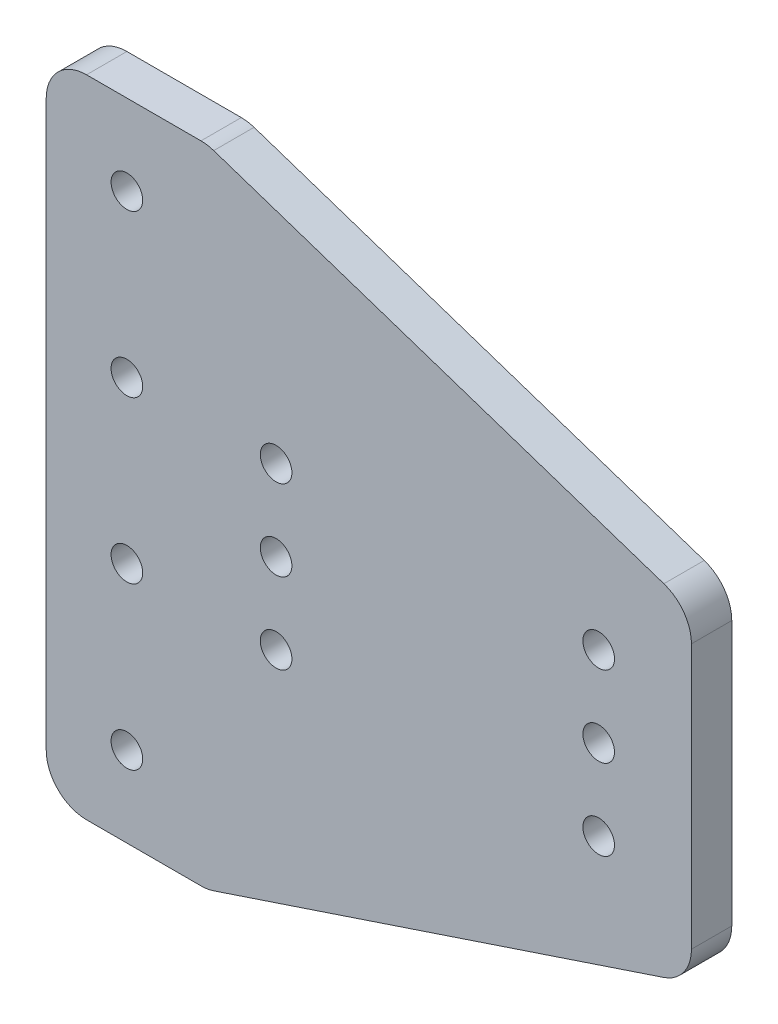
ISO-10303-21;
HEADER;
FILE_DESCRIPTION(('STEP AP214'),'2;1');
FILE_NAME('part.step','',(''),(''),'','','');
FILE_SCHEMA(('AUTOMOTIVE_DESIGN { 1 0 10303 214 1 1 1 1 }'));
ENDSEC;
DATA;
#1=APPLICATION_CONTEXT('core data for automotive mechanical design processes');
#2=APPLICATION_PROTOCOL_DEFINITION('international standard','automotive_design',2000,#1);
#3=PRODUCT_CONTEXT('',#1,'mechanical');
#4=PRODUCT('Part','Part','',(#3));
#5=PRODUCT_RELATED_PRODUCT_CATEGORY('part','',(#4));
#6=PRODUCT_DEFINITION_FORMATION('','',#4);
#7=PRODUCT_DEFINITION_CONTEXT('part definition',#1,'design');
#8=PRODUCT_DEFINITION('design','',#6,#7);
#9=PRODUCT_DEFINITION_SHAPE('','',#8);
#10=(LENGTH_UNIT() NAMED_UNIT(*) SI_UNIT(.MILLI.,.METRE.));
#11=(NAMED_UNIT(*) PLANE_ANGLE_UNIT() SI_UNIT($,.RADIAN.));
#12=(NAMED_UNIT(*) SI_UNIT($,.STERADIAN.) SOLID_ANGLE_UNIT());
#13=UNCERTAINTY_MEASURE_WITH_UNIT(LENGTH_MEASURE(1.E-05),#10,'distance_accuracy_value','');
#14=(GEOMETRIC_REPRESENTATION_CONTEXT(3) GLOBAL_UNCERTAINTY_ASSIGNED_CONTEXT((#13)) GLOBAL_UNIT_ASSIGNED_CONTEXT((#10,
#11,#12)) REPRESENTATION_CONTEXT('',''));
#15=CARTESIAN_POINT('',(0.,0.,0.));
#16=DIRECTION('',(0.,0.,1.));
#17=DIRECTION('',(1.,0.,0.));
#18=AXIS2_PLACEMENT_3D('',#15,#16,#17);
#19=CARTESIAN_POINT('',(0.,0.,6.35));
#20=DIRECTION('',(0.,0.,-1.));
#21=DIRECTION('',(-1.,0.,0.));
#22=AXIS2_PLACEMENT_3D('',#19,#20,#21);
#23=PLANE('',#22);
#24=DIRECTION('',(0.948683298050514,-0.316227766016838,0.));
#25=VECTOR('',#24,1.);
#26=CARTESIAN_POINT('',(25.4,101.6,6.35));
#27=LINE('',#26,#25);
#28=CARTESIAN_POINT('',(26.3775831721377,101.274138942621,6.35));
#29=VERTEX_POINT('',#28);
#30=CARTESIAN_POINT('',(97.2580463142069,77.6473178952644,6.35));
#31=VERTEX_POINT('',#30);
#32=EDGE_CURVE('E453',#29,#31,#27,.T.);
#33=ORIENTED_EDGE('',*,*,#32,.F.);
#34=CARTESIAN_POINT('',(24.3695368579308,95.25,6.35));
#35=DIRECTION('',(0.,0.,-1.));
#36=DIRECTION('',(-1.,0.,0.));
#37=AXIS2_PLACEMENT_3D('',#34,#35,#36);
#38=CIRCLE('',#37,6.35);
#39=CARTESIAN_POINT('',(24.3695368579308,101.6,6.35));
#40=VERTEX_POINT('',#39);
#41=EDGE_CURVE('E418',#29,#40,#38,.F.);
#42=ORIENTED_EDGE('',*,*,#41,.T.);
#43=DIRECTION('',(1.,0.,0.));
#44=VECTOR('',#43,1.);
#45=CARTESIAN_POINT('',(0.,101.6,6.35));
#46=LINE('',#45,#44);
#47=CARTESIAN_POINT('',(6.35,101.6,6.35));
#48=VERTEX_POINT('',#47);
#49=EDGE_CURVE('E449',#48,#40,#46,.T.);
#50=ORIENTED_EDGE('',*,*,#49,.F.);
#51=CARTESIAN_POINT('',(6.35,95.25,6.35));
#52=DIRECTION('',(0.,0.,-1.));
#53=DIRECTION('',(-1.,0.,0.));
#54=AXIS2_PLACEMENT_3D('',#51,#52,#53);
#55=CIRCLE('',#54,6.35);
#56=CARTESIAN_POINT('',(0.,95.25,6.35));
#57=VERTEX_POINT('',#56);
#58=EDGE_CURVE('E370',#48,#57,#55,.F.);
#59=ORIENTED_EDGE('',*,*,#58,.T.);
#60=DIRECTION('',(0.,1.,0.));
#61=VECTOR('',#60,1.);
#62=CARTESIAN_POINT('',(0.,0.,6.35));
#63=LINE('',#62,#61);
#64=CARTESIAN_POINT('',(0.,6.35,6.35));
#65=VERTEX_POINT('',#64);
#66=EDGE_CURVE('E446',#65,#57,#63,.T.);
#67=ORIENTED_EDGE('',*,*,#66,.F.);
#68=CARTESIAN_POINT('',(6.35,6.35,6.35));
#69=DIRECTION('',(0.,0.,-1.));
#70=DIRECTION('',(-1.,0.,0.));
#71=AXIS2_PLACEMENT_3D('',#68,#69,#70);
#72=CIRCLE('',#71,6.35);
#73=CARTESIAN_POINT('',(6.35,0.,6.35));
#74=VERTEX_POINT('',#73);
#75=EDGE_CURVE('E407',#65,#74,#72,.F.);
#76=ORIENTED_EDGE('',*,*,#75,.T.);
#77=DIRECTION('',(1.,0.,0.));
#78=VECTOR('',#77,1.);
#79=CARTESIAN_POINT('',(0.,0.,6.35));
#80=LINE('',#79,#78);
#81=CARTESIAN_POINT('',(24.3695368579308,0.,6.35));
#82=VERTEX_POINT('',#81);
#83=EDGE_CURVE('E372',#74,#82,#80,.T.);
#84=ORIENTED_EDGE('',*,*,#83,.T.);
#85=CARTESIAN_POINT('',(24.3695368579308,6.35,6.35));
#86=DIRECTION('',(0.,0.,-1.));
#87=DIRECTION('',(-1.,0.,0.));
#88=AXIS2_PLACEMENT_3D('',#85,#86,#87);
#89=CIRCLE('',#88,6.35);
#90=CARTESIAN_POINT('',(26.3775831721377,0.325861057379238,6.35));
#91=VERTEX_POINT('',#90);
#92=EDGE_CURVE('E413',#82,#91,#89,.F.);
#93=ORIENTED_EDGE('',*,*,#92,.T.);
#94=DIRECTION('',(0.948683298050514,0.316227766016838,0.));
#95=VECTOR('',#94,1.);
#96=CARTESIAN_POINT('',(25.4,0.,6.35));
#97=LINE('',#96,#95);
#98=CARTESIAN_POINT('',(97.2580463142069,23.9526821047356,6.35));
#99=VERTEX_POINT('',#98);
#100=EDGE_CURVE('E378',#91,#99,#97,.T.);
#101=ORIENTED_EDGE('',*,*,#100,.T.);
#102=CARTESIAN_POINT('',(95.25,29.9768210473564,6.35));
#103=DIRECTION('',(0.,0.,-1.));
#104=DIRECTION('',(-1.,0.,0.));
#105=AXIS2_PLACEMENT_3D('',#102,#103,#104);
#106=CIRCLE('',#105,6.35);
#107=CARTESIAN_POINT('',(101.6,29.9768210473564,6.35));
#108=VERTEX_POINT('',#107);
#109=EDGE_CURVE('E276',#99,#108,#106,.F.);
#110=ORIENTED_EDGE('',*,*,#109,.T.);
#111=DIRECTION('',(0.,1.,0.));
#112=VECTOR('',#111,1.);
#113=CARTESIAN_POINT('',(101.6,25.4,6.35));
#114=LINE('',#113,#112);
#115=CARTESIAN_POINT('',(101.6,71.6231789526436,6.35));
#116=VERTEX_POINT('',#115);
#117=EDGE_CURVE('E464',#108,#116,#114,.T.);
#118=ORIENTED_EDGE('',*,*,#117,.T.);
#119=CARTESIAN_POINT('',(95.25,71.6231789526436,6.35));
#120=DIRECTION('',(0.,0.,-1.));
#121=DIRECTION('',(-1.,0.,0.));
#122=AXIS2_PLACEMENT_3D('',#119,#120,#121);
#123=CIRCLE('',#122,6.35);
#124=EDGE_CURVE('E410',#116,#31,#123,.F.);
#125=ORIENTED_EDGE('',*,*,#124,.T.);
#126=EDGE_LOOP('',(#33,#42,#50,#59,#67,#76,#84,#93,#101,#110,#118,#125));
#127=FACE_BOUND('',#126,.T.);
#128=CARTESIAN_POINT('',(36.195,63.5,6.35));
#129=DIRECTION('',(0.,0.,1.));
#130=DIRECTION('',(1.,0.,0.));
#131=AXIS2_PLACEMENT_3D('',#128,#129,#130);
#132=CIRCLE('',#131,2.4892);
#133=CARTESIAN_POINT('',(38.6842,63.5,6.35));
#134=VERTEX_POINT('',#133);
#135=EDGE_CURVE('E470',#134,#134,#132,.T.);
#136=ORIENTED_EDGE('',*,*,#135,.F.);
#137=EDGE_LOOP('',(#136));
#138=FACE_BOUND('',#137,.T.);
#139=CARTESIAN_POINT('',(36.195,50.8,6.35));
#140=DIRECTION('',(0.,0.,1.));
#141=DIRECTION('',(1.,0.,0.));
#142=AXIS2_PLACEMENT_3D('',#139,#140,#141);
#143=CIRCLE('',#142,2.4892);
#144=CARTESIAN_POINT('',(38.6842,50.8,6.35));
#145=VERTEX_POINT('',#144);
#146=EDGE_CURVE('E840',#145,#145,#143,.T.);
#147=ORIENTED_EDGE('',*,*,#146,.F.);
#148=EDGE_LOOP('',(#147));
#149=FACE_BOUND('',#148,.T.);
#150=CARTESIAN_POINT('',(36.195,38.1,6.35));
#151=DIRECTION('',(0.,0.,1.));
#152=DIRECTION('',(1.,0.,0.));
#153=AXIS2_PLACEMENT_3D('',#150,#151,#152);
#154=CIRCLE('',#153,2.4892);
#155=CARTESIAN_POINT('',(38.6842,38.1,6.35));
#156=VERTEX_POINT('',#155);
#157=EDGE_CURVE('E832',#156,#156,#154,.T.);
#158=ORIENTED_EDGE('',*,*,#157,.F.);
#159=EDGE_LOOP('',(#158));
#160=FACE_BOUND('',#159,.T.);
#161=CARTESIAN_POINT('',(86.995,63.5,6.35));
#162=DIRECTION('',(0.,0.,1.));
#163=DIRECTION('',(1.,0.,0.));
#164=AXIS2_PLACEMENT_3D('',#161,#162,#163);
#165=CIRCLE('',#164,2.48920000000002);
#166=CARTESIAN_POINT('',(89.4842,63.5,6.35));
#167=VERTEX_POINT('',#166);
#168=EDGE_CURVE('E824',#167,#167,#165,.T.);
#169=ORIENTED_EDGE('',*,*,#168,.F.);
#170=EDGE_LOOP('',(#169));
#171=FACE_BOUND('',#170,.T.);
#172=CARTESIAN_POINT('',(86.995,50.8,6.35));
#173=DIRECTION('',(0.,0.,1.));
#174=DIRECTION('',(1.,0.,0.));
#175=AXIS2_PLACEMENT_3D('',#172,#173,#174);
#176=CIRCLE('',#175,2.4892);
#177=CARTESIAN_POINT('',(89.4842,50.8,6.35));
#178=VERTEX_POINT('',#177);
#179=EDGE_CURVE('E816',#178,#178,#176,.T.);
#180=ORIENTED_EDGE('',*,*,#179,.F.);
#181=EDGE_LOOP('',(#180));
#182=FACE_BOUND('',#181,.T.);
#183=CARTESIAN_POINT('',(86.995,38.1,6.35));
#184=DIRECTION('',(0.,0.,1.));
#185=DIRECTION('',(1.,0.,0.));
#186=AXIS2_PLACEMENT_3D('',#183,#184,#185);
#187=CIRCLE('',#186,2.4892);
#188=CARTESIAN_POINT('',(89.4842,38.1,6.35));
#189=VERTEX_POINT('',#188);
#190=EDGE_CURVE('E808',#189,#189,#187,.T.);
#191=ORIENTED_EDGE('',*,*,#190,.F.);
#192=EDGE_LOOP('',(#191));
#193=FACE_BOUND('',#192,.T.);
#194=CARTESIAN_POINT('',(12.7,88.9,6.35));
#195=DIRECTION('',(0.,0.,1.));
#196=DIRECTION('',(1.,0.,0.));
#197=AXIS2_PLACEMENT_3D('',#194,#195,#196);
#198=CIRCLE('',#197,2.4892);
#199=CARTESIAN_POINT('',(15.1892,88.9,6.35));
#200=VERTEX_POINT('',#199);
#201=EDGE_CURVE('E800',#200,#200,#198,.T.);
#202=ORIENTED_EDGE('',*,*,#201,.F.);
#203=EDGE_LOOP('',(#202));
#204=FACE_BOUND('',#203,.T.);
#205=CARTESIAN_POINT('',(12.7000000000003,63.5,6.35));
#206=DIRECTION('',(0.,0.,1.));
#207=DIRECTION('',(1.,0.,0.));
#208=AXIS2_PLACEMENT_3D('',#205,#206,#207);
#209=CIRCLE('',#208,2.4892);
#210=CARTESIAN_POINT('',(15.1892000000003,63.5,6.35));
#211=VERTEX_POINT('',#210);
#212=EDGE_CURVE('E792',#211,#211,#209,.T.);
#213=ORIENTED_EDGE('',*,*,#212,.F.);
#214=EDGE_LOOP('',(#213));
#215=FACE_BOUND('',#214,.T.);
#216=CARTESIAN_POINT('',(12.7000000000005,38.1,6.35));
#217=DIRECTION('',(0.,0.,1.));
#218=DIRECTION('',(1.,0.,0.));
#219=AXIS2_PLACEMENT_3D('',#216,#217,#218);
#220=CIRCLE('',#219,2.4892);
#221=CARTESIAN_POINT('',(15.1892000000005,38.1,6.35));
#222=VERTEX_POINT('',#221);
#223=EDGE_CURVE('E776',#222,#222,#220,.T.);
#224=ORIENTED_EDGE('',*,*,#223,.F.);
#225=EDGE_LOOP('',(#224));
#226=FACE_BOUND('',#225,.T.);
#227=CARTESIAN_POINT('',(12.7000000000008,12.7,6.35));
#228=DIRECTION('',(0.,0.,1.));
#229=DIRECTION('',(1.,0.,0.));
#230=AXIS2_PLACEMENT_3D('',#227,#228,#229);
#231=CIRCLE('',#230,2.4892);
#232=CARTESIAN_POINT('',(15.1892000000008,12.7,6.35));
#233=VERTEX_POINT('',#232);
#234=EDGE_CURVE('E781',#233,#233,#231,.T.);
#235=ORIENTED_EDGE('',*,*,#234,.F.);
#236=EDGE_LOOP('',(#235));
#237=FACE_BOUND('',#236,.T.);
#238=ADVANCED_FACE('F253',(#127,#138,#149,#160,#171,#182,#193,#204,#215,#226,#237),#23,.F.);
#239=CARTESIAN_POINT('',(0.,0.,0.));
#240=DIRECTION('',(0.,0.,-1.));
#241=DIRECTION('',(-1.,0.,0.));
#242=AXIS2_PLACEMENT_3D('',#239,#240,#241);
#243=PLANE('',#242);
#244=CARTESIAN_POINT('',(12.7000000000005,38.1,0.));
#245=DIRECTION('',(0.,0.,1.));
#246=DIRECTION('',(1.,0.,0.));
#247=AXIS2_PLACEMENT_3D('',#244,#245,#246);
#248=CIRCLE('',#247,2.4892);
#249=CARTESIAN_POINT('',(15.1892000000005,38.1,0.));
#250=VERTEX_POINT('',#249);
#251=EDGE_CURVE('E779',#250,#250,#248,.T.);
#252=ORIENTED_EDGE('',*,*,#251,.T.);
#253=EDGE_LOOP('',(#252));
#254=FACE_BOUND('',#253,.T.);
#255=CARTESIAN_POINT('',(12.7,88.9,0.));
#256=DIRECTION('',(0.,0.,1.));
#257=DIRECTION('',(1.,0.,0.));
#258=AXIS2_PLACEMENT_3D('',#255,#256,#257);
#259=CIRCLE('',#258,2.4892);
#260=CARTESIAN_POINT('',(15.1892,88.9,0.));
#261=VERTEX_POINT('',#260);
#262=EDGE_CURVE('E796',#261,#261,#259,.T.);
#263=ORIENTED_EDGE('',*,*,#262,.T.);
#264=EDGE_LOOP('',(#263));
#265=FACE_BOUND('',#264,.T.);
#266=CARTESIAN_POINT('',(86.995,50.8,0.));
#267=DIRECTION('',(0.,0.,1.));
#268=DIRECTION('',(1.,0.,0.));
#269=AXIS2_PLACEMENT_3D('',#266,#267,#268);
#270=CIRCLE('',#269,2.4892);
#271=CARTESIAN_POINT('',(89.4842,50.8,0.));
#272=VERTEX_POINT('',#271);
#273=EDGE_CURVE('E812',#272,#272,#270,.T.);
#274=ORIENTED_EDGE('',*,*,#273,.T.);
#275=EDGE_LOOP('',(#274));
#276=FACE_BOUND('',#275,.T.);
#277=CARTESIAN_POINT('',(36.195,38.1,0.));
#278=DIRECTION('',(0.,0.,1.));
#279=DIRECTION('',(1.,0.,0.));
#280=AXIS2_PLACEMENT_3D('',#277,#278,#279);
#281=CIRCLE('',#280,2.4892);
#282=CARTESIAN_POINT('',(38.6842,38.1,0.));
#283=VERTEX_POINT('',#282);
#284=EDGE_CURVE('E828',#283,#283,#281,.T.);
#285=ORIENTED_EDGE('',*,*,#284,.T.);
#286=EDGE_LOOP('',(#285));
#287=FACE_BOUND('',#286,.T.);
#288=CARTESIAN_POINT('',(36.195,63.5,0.));
#289=DIRECTION('',(0.,0.,1.));
#290=DIRECTION('',(1.,0.,0.));
#291=AXIS2_PLACEMENT_3D('',#288,#289,#290);
#292=CIRCLE('',#291,2.4892);
#293=CARTESIAN_POINT('',(38.6842,63.5,0.));
#294=VERTEX_POINT('',#293);
#295=EDGE_CURVE('E458',#294,#294,#292,.T.);
#296=ORIENTED_EDGE('',*,*,#295,.T.);
#297=EDGE_LOOP('',(#296));
#298=FACE_BOUND('',#297,.T.);
#299=DIRECTION('',(1.,0.,0.));
#300=VECTOR('',#299,1.);
#301=CARTESIAN_POINT('',(0.,101.6,0.));
#302=LINE('',#301,#300);
#303=CARTESIAN_POINT('',(6.35,101.6,0.));
#304=VERTEX_POINT('',#303);
#305=CARTESIAN_POINT('',(24.3695368579308,101.6,0.));
#306=VERTEX_POINT('',#305);
#307=EDGE_CURVE('E348',#304,#306,#302,.T.);
#308=ORIENTED_EDGE('',*,*,#307,.T.);
#309=CARTESIAN_POINT('',(24.3695368579308,95.25,0.));
#310=DIRECTION('',(0.,0.,-1.));
#311=DIRECTION('',(-1.,0.,0.));
#312=AXIS2_PLACEMENT_3D('',#309,#310,#311);
#313=CIRCLE('',#312,6.35);
#314=CARTESIAN_POINT('',(26.3775831721377,101.274138942621,0.));
#315=VERTEX_POINT('',#314);
#316=EDGE_CURVE('E395',#306,#315,#313,.T.);
#317=ORIENTED_EDGE('',*,*,#316,.T.);
#318=DIRECTION('',(0.948683298050514,-0.316227766016838,0.));
#319=VECTOR('',#318,1.);
#320=CARTESIAN_POINT('',(25.4,101.6,0.));
#321=LINE('',#320,#319);
#322=CARTESIAN_POINT('',(97.2580463142069,77.6473178952644,0.));
#323=VERTEX_POINT('',#322);
#324=EDGE_CURVE('E367',#315,#323,#321,.T.);
#325=ORIENTED_EDGE('',*,*,#324,.T.);
#326=CARTESIAN_POINT('',(95.25,71.6231789526436,0.));
#327=DIRECTION('',(0.,0.,-1.));
#328=DIRECTION('',(-1.,0.,0.));
#329=AXIS2_PLACEMENT_3D('',#326,#327,#328);
#330=CIRCLE('',#329,6.35);
#331=CARTESIAN_POINT('',(101.6,71.6231789526436,0.));
#332=VERTEX_POINT('',#331);
#333=EDGE_CURVE('E386',#323,#332,#330,.T.);
#334=ORIENTED_EDGE('',*,*,#333,.T.);
#335=DIRECTION('',(0.,1.,0.));
#336=VECTOR('',#335,1.);
#337=CARTESIAN_POINT('',(101.6,25.4,0.));
#338=LINE('',#337,#336);
#339=CARTESIAN_POINT('',(101.6,29.9768210473564,0.));
#340=VERTEX_POINT('',#339);
#341=EDGE_CURVE('E475',#340,#332,#338,.T.);
#342=ORIENTED_EDGE('',*,*,#341,.F.);
#343=CARTESIAN_POINT('',(95.25,29.9768210473564,0.));
#344=DIRECTION('',(0.,0.,-1.));
#345=DIRECTION('',(-1.,0.,0.));
#346=AXIS2_PLACEMENT_3D('',#343,#344,#345);
#347=CIRCLE('',#346,6.35);
#348=CARTESIAN_POINT('',(97.2580463142069,23.9526821047356,0.));
#349=VERTEX_POINT('',#348);
#350=EDGE_CURVE('E392',#340,#349,#347,.T.);
#351=ORIENTED_EDGE('',*,*,#350,.T.);
#352=DIRECTION('',(0.948683298050514,0.316227766016838,0.));
#353=VECTOR('',#352,1.);
#354=CARTESIAN_POINT('',(25.4,0.,0.));
#355=LINE('',#354,#353);
#356=CARTESIAN_POINT('',(26.3775831721377,0.325861057379238,0.));
#357=VERTEX_POINT('',#356);
#358=EDGE_CURVE('E456',#357,#349,#355,.T.);
#359=ORIENTED_EDGE('',*,*,#358,.F.);
#360=CARTESIAN_POINT('',(24.3695368579308,6.35,0.));
#361=DIRECTION('',(0.,0.,-1.));
#362=DIRECTION('',(-1.,0.,0.));
#363=AXIS2_PLACEMENT_3D('',#360,#361,#362);
#364=CIRCLE('',#363,6.35);
#365=CARTESIAN_POINT('',(24.3695368579308,0.,0.));
#366=VERTEX_POINT('',#365);
#367=EDGE_CURVE('E389',#357,#366,#364,.T.);
#368=ORIENTED_EDGE('',*,*,#367,.T.);
#369=DIRECTION('',(1.,0.,0.));
#370=VECTOR('',#369,1.);
#371=CARTESIAN_POINT('',(0.,0.,0.));
#372=LINE('',#371,#370);
#373=CARTESIAN_POINT('',(6.35,0.,0.));
#374=VERTEX_POINT('',#373);
#375=EDGE_CURVE('E381',#374,#366,#372,.T.);
#376=ORIENTED_EDGE('',*,*,#375,.F.);
#377=CARTESIAN_POINT('',(6.35,6.35,0.));
#378=DIRECTION('',(0.,0.,-1.));
#379=DIRECTION('',(-1.,0.,0.));
#380=AXIS2_PLACEMENT_3D('',#377,#378,#379);
#381=CIRCLE('',#380,6.35);
#382=CARTESIAN_POINT('',(0.,6.35,0.));
#383=VERTEX_POINT('',#382);
#384=EDGE_CURVE('E356',#374,#383,#381,.T.);
#385=ORIENTED_EDGE('',*,*,#384,.T.);
#386=DIRECTION('',(0.,1.,0.));
#387=VECTOR('',#386,1.);
#388=CARTESIAN_POINT('',(0.,0.,0.));
#389=LINE('',#388,#387);
#390=CARTESIAN_POINT('',(0.,95.25,0.));
#391=VERTEX_POINT('',#390);
#392=EDGE_CURVE('E350',#383,#391,#389,.T.);
#393=ORIENTED_EDGE('',*,*,#392,.T.);
#394=CARTESIAN_POINT('',(6.35,95.25,0.));
#395=DIRECTION('',(0.,0.,-1.));
#396=DIRECTION('',(-1.,0.,0.));
#397=AXIS2_PLACEMENT_3D('',#394,#395,#396);
#398=CIRCLE('',#397,6.35);
#399=EDGE_CURVE('E344',#391,#304,#398,.T.);
#400=ORIENTED_EDGE('',*,*,#399,.T.);
#401=EDGE_LOOP('',(#308,#317,#325,#334,#342,#351,#359,#368,#376,#385,#393,#400));
#402=FACE_BOUND('',#401,.T.);
#403=CARTESIAN_POINT('',(36.195,50.8,0.));
#404=DIRECTION('',(0.,0.,1.));
#405=DIRECTION('',(1.,0.,0.));
#406=AXIS2_PLACEMENT_3D('',#403,#404,#405);
#407=CIRCLE('',#406,2.4892);
#408=CARTESIAN_POINT('',(38.6842,50.8,0.));
#409=VERTEX_POINT('',#408);
#410=EDGE_CURVE('E836',#409,#409,#407,.T.);
#411=ORIENTED_EDGE('',*,*,#410,.T.);
#412=EDGE_LOOP('',(#411));
#413=FACE_BOUND('',#412,.T.);
#414=CARTESIAN_POINT('',(86.995,63.5,0.));
#415=DIRECTION('',(0.,0.,1.));
#416=DIRECTION('',(1.,0.,0.));
#417=AXIS2_PLACEMENT_3D('',#414,#415,#416);
#418=CIRCLE('',#417,2.48920000000002);
#419=CARTESIAN_POINT('',(89.4842,63.5,0.));
#420=VERTEX_POINT('',#419);
#421=EDGE_CURVE('E820',#420,#420,#418,.T.);
#422=ORIENTED_EDGE('',*,*,#421,.T.);
#423=EDGE_LOOP('',(#422));
#424=FACE_BOUND('',#423,.T.);
#425=CARTESIAN_POINT('',(86.995,38.1,0.));
#426=DIRECTION('',(0.,0.,1.));
#427=DIRECTION('',(1.,0.,0.));
#428=AXIS2_PLACEMENT_3D('',#425,#426,#427);
#429=CIRCLE('',#428,2.4892);
#430=CARTESIAN_POINT('',(89.4842,38.1,0.));
#431=VERTEX_POINT('',#430);
#432=EDGE_CURVE('E804',#431,#431,#429,.T.);
#433=ORIENTED_EDGE('',*,*,#432,.T.);
#434=EDGE_LOOP('',(#433));
#435=FACE_BOUND('',#434,.T.);
#436=CARTESIAN_POINT('',(12.7000000000003,63.5,0.));
#437=DIRECTION('',(0.,0.,1.));
#438=DIRECTION('',(1.,0.,0.));
#439=AXIS2_PLACEMENT_3D('',#436,#437,#438);
#440=CIRCLE('',#439,2.4892);
#441=CARTESIAN_POINT('',(15.1892000000003,63.5,0.));
#442=VERTEX_POINT('',#441);
#443=EDGE_CURVE('E785',#442,#442,#440,.T.);
#444=ORIENTED_EDGE('',*,*,#443,.T.);
#445=EDGE_LOOP('',(#444));
#446=FACE_BOUND('',#445,.T.);
#447=CARTESIAN_POINT('',(12.7000000000008,12.7,0.));
#448=DIRECTION('',(0.,0.,1.));
#449=DIRECTION('',(1.,0.,0.));
#450=AXIS2_PLACEMENT_3D('',#447,#448,#449);
#451=CIRCLE('',#450,2.4892);
#452=CARTESIAN_POINT('',(15.1892000000008,12.7,0.));
#453=VERTEX_POINT('',#452);
#454=EDGE_CURVE('E788',#453,#453,#451,.T.);
#455=ORIENTED_EDGE('',*,*,#454,.T.);
#456=EDGE_LOOP('',(#455));
#457=FACE_BOUND('',#456,.T.);
#458=ADVANCED_FACE('F346',(#254,#265,#276,#287,#298,#402,#413,#424,#435,#446,#457),#243,.T.);
#459=CARTESIAN_POINT('',(0.,0.,6.35));
#460=DIRECTION('',(-1.,0.,0.));
#461=DIRECTION('',(0.,0.,1.));
#462=AXIS2_PLACEMENT_3D('',#459,#460,#461);
#463=PLANE('',#462);
#464=ORIENTED_EDGE('',*,*,#392,.F.);
#465=DIRECTION('',(0.,0.,-1.));
#466=VECTOR('',#465,1.);
#467=CARTESIAN_POINT('',(0.,6.35,6.35));
#468=LINE('',#467,#466);
#469=EDGE_CURVE('E12',#383,#65,#468,.F.);
#470=ORIENTED_EDGE('',*,*,#469,.T.);
#471=ORIENTED_EDGE('',*,*,#66,.T.);
#472=DIRECTION('',(0.,0.,-1.));
#473=VECTOR('',#472,1.);
#474=CARTESIAN_POINT('',(0.,95.25,6.35));
#475=LINE('',#474,#473);
#476=EDGE_CURVE('E262',#57,#391,#475,.T.);
#477=ORIENTED_EDGE('',*,*,#476,.T.);
#478=EDGE_LOOP('',(#464,#470,#471,#477));
#479=FACE_BOUND('',#478,.T.);
#480=ADVANCED_FACE('F443',(#479),#463,.T.);
#481=CARTESIAN_POINT('',(0.,0.,6.35));
#482=DIRECTION('',(0.,1.,0.));
#483=DIRECTION('',(0.,0.,1.));
#484=AXIS2_PLACEMENT_3D('',#481,#482,#483);
#485=PLANE('',#484);
#486=ORIENTED_EDGE('',*,*,#375,.T.);
#487=DIRECTION('',(0.,0.,-1.));
#488=VECTOR('',#487,1.);
#489=CARTESIAN_POINT('',(24.3695368579308,0.,6.35));
#490=LINE('',#489,#488);
#491=EDGE_CURVE('E438',#366,#82,#490,.F.);
#492=ORIENTED_EDGE('',*,*,#491,.T.);
#493=ORIENTED_EDGE('',*,*,#83,.F.);
#494=DIRECTION('',(0.,0.,-1.));
#495=VECTOR('',#494,1.);
#496=CARTESIAN_POINT('',(6.35,0.,0.));
#497=LINE('',#496,#495);
#498=EDGE_CURVE('E434',#74,#374,#497,.T.);
#499=ORIENTED_EDGE('',*,*,#498,.T.);
#500=EDGE_LOOP('',(#486,#492,#493,#499));
#501=FACE_BOUND('',#500,.T.);
#502=ADVANCED_FACE('F527',(#501),#485,.F.);
#503=CARTESIAN_POINT('',(25.4,0.,6.35));
#504=DIRECTION('',(-0.316227766016838,0.948683298050514,0.));
#505=DIRECTION('',(-0.948683298050514,-0.316227766016838,0.));
#506=AXIS2_PLACEMENT_3D('',#503,#504,#505);
#507=PLANE('',#506);
#508=ORIENTED_EDGE('',*,*,#358,.T.);
#509=DIRECTION('',(0.,0.,-1.));
#510=VECTOR('',#509,1.);
#511=CARTESIAN_POINT('',(97.258046314207,23.9526821047357,6.35));
#512=LINE('',#511,#510);
#513=EDGE_CURVE('E431',#349,#99,#512,.F.);
#514=ORIENTED_EDGE('',*,*,#513,.T.);
#515=ORIENTED_EDGE('',*,*,#100,.F.);
#516=DIRECTION('',(0.,0.,-1.));
#517=VECTOR('',#516,1.);
#518=CARTESIAN_POINT('',(26.3775831721377,0.325861057379238,6.35));
#519=LINE('',#518,#517);
#520=EDGE_CURVE('E427',#91,#357,#519,.T.);
#521=ORIENTED_EDGE('',*,*,#520,.T.);
#522=EDGE_LOOP('',(#508,#514,#515,#521));
#523=FACE_BOUND('',#522,.T.);
#524=ADVANCED_FACE('F482',(#523),#507,.F.);
#525=CARTESIAN_POINT('',(101.6,25.4,6.35));
#526=DIRECTION('',(-1.,0.,0.));
#527=DIRECTION('',(0.,0.,1.));
#528=AXIS2_PLACEMENT_3D('',#525,#526,#527);
#529=PLANE('',#528);
#530=ORIENTED_EDGE('',*,*,#117,.F.);
#531=DIRECTION('',(0.,0.,-1.));
#532=VECTOR('',#531,1.);
#533=CARTESIAN_POINT('',(101.6,29.9768210473564,6.35));
#534=LINE('',#533,#532);
#535=EDGE_CURVE('E423',#108,#340,#534,.T.);
#536=ORIENTED_EDGE('',*,*,#535,.T.);
#537=ORIENTED_EDGE('',*,*,#341,.T.);
#538=DIRECTION('',(0.,0.,-1.));
#539=VECTOR('',#538,1.);
#540=CARTESIAN_POINT('',(101.6,71.6231789526436,6.35));
#541=LINE('',#540,#539);
#542=EDGE_CURVE('E269',#332,#116,#541,.F.);
#543=ORIENTED_EDGE('',*,*,#542,.T.);
#544=EDGE_LOOP('',(#530,#536,#537,#543));
#545=FACE_BOUND('',#544,.T.);
#546=ADVANCED_FACE('F489',(#545),#529,.F.);
#547=CARTESIAN_POINT('',(25.4,101.6,6.35));
#548=DIRECTION('',(0.316227766016838,0.948683298050514,0.));
#549=DIRECTION('',(-0.948683298050514,0.316227766016838,0.));
#550=AXIS2_PLACEMENT_3D('',#547,#548,#549);
#551=PLANE('',#550);
#552=ORIENTED_EDGE('',*,*,#324,.F.);
#553=DIRECTION('',(0.,0.,-1.));
#554=VECTOR('',#553,1.);
#555=CARTESIAN_POINT('',(26.3775831721377,101.274138942621,6.35));
#556=LINE('',#555,#554);
#557=EDGE_CURVE('E402',#315,#29,#556,.F.);
#558=ORIENTED_EDGE('',*,*,#557,.T.);
#559=ORIENTED_EDGE('',*,*,#32,.T.);
#560=DIRECTION('',(0.,0.,-1.));
#561=VECTOR('',#560,1.);
#562=CARTESIAN_POINT('',(97.2580463142069,77.6473178952643,0.));
#563=LINE('',#562,#561);
#564=EDGE_CURVE('E398',#31,#323,#563,.T.);
#565=ORIENTED_EDGE('',*,*,#564,.T.);
#566=EDGE_LOOP('',(#552,#558,#559,#565));
#567=FACE_BOUND('',#566,.T.);
#568=ADVANCED_FACE('F496',(#567),#551,.T.);
#569=CARTESIAN_POINT('',(0.,101.6,6.35));
#570=DIRECTION('',(0.,1.,0.));
#571=DIRECTION('',(0.,0.,1.));
#572=AXIS2_PLACEMENT_3D('',#569,#570,#571);
#573=PLANE('',#572);
#574=ORIENTED_EDGE('',*,*,#49,.T.);
#575=DIRECTION('',(0.,0.,-1.));
#576=VECTOR('',#575,1.);
#577=CARTESIAN_POINT('',(24.3695368579308,101.6,6.35));
#578=LINE('',#577,#576);
#579=EDGE_CURVE('E357',#40,#306,#578,.T.);
#580=ORIENTED_EDGE('',*,*,#579,.T.);
#581=ORIENTED_EDGE('',*,*,#307,.F.);
#582=DIRECTION('',(0.,0.,-1.));
#583=VECTOR('',#582,1.);
#584=CARTESIAN_POINT('',(6.35,101.6,6.35));
#585=LINE('',#584,#583);
#586=EDGE_CURVE('E363',#304,#48,#585,.F.);
#587=ORIENTED_EDGE('',*,*,#586,.T.);
#588=EDGE_LOOP('',(#574,#580,#581,#587));
#589=FACE_BOUND('',#588,.T.);
#590=ADVANCED_FACE('F362',(#589),#573,.T.);
#591=CARTESIAN_POINT('',(36.195,63.5,6.35));
#592=DIRECTION('',(0.,0.,-1.));
#593=DIRECTION('',(-1.,0.,0.));
#594=AXIS2_PLACEMENT_3D('',#591,#592,#593);
#595=CYLINDRICAL_SURFACE('',#594,2.4892);
#596=ORIENTED_EDGE('',*,*,#135,.T.);
#597=EDGE_LOOP('',(#596));
#598=FACE_BOUND('',#597,.T.);
#599=ORIENTED_EDGE('',*,*,#295,.F.);
#600=EDGE_LOOP('',(#599));
#601=FACE_BOUND('',#600,.T.);
#602=ADVANCED_FACE('F524',(#598,#601),#595,.F.);
#603=CARTESIAN_POINT('',(36.195,50.8,6.35));
#604=DIRECTION('',(0.,0.,-1.));
#605=DIRECTION('',(-1.,0.,0.));
#606=AXIS2_PLACEMENT_3D('',#603,#604,#605);
#607=CYLINDRICAL_SURFACE('',#606,2.4892);
#608=ORIENTED_EDGE('',*,*,#146,.T.);
#609=EDGE_LOOP('',(#608));
#610=FACE_BOUND('',#609,.T.);
#611=ORIENTED_EDGE('',*,*,#410,.F.);
#612=EDGE_LOOP('',(#611));
#613=FACE_BOUND('',#612,.T.);
#614=ADVANCED_FACE('F569',(#610,#613),#607,.F.);
#615=CARTESIAN_POINT('',(36.195,38.1,6.35));
#616=DIRECTION('',(0.,0.,-1.));
#617=DIRECTION('',(-1.,0.,0.));
#618=AXIS2_PLACEMENT_3D('',#615,#616,#617);
#619=CYLINDRICAL_SURFACE('',#618,2.4892);
#620=ORIENTED_EDGE('',*,*,#157,.T.);
#621=EDGE_LOOP('',(#620));
#622=FACE_BOUND('',#621,.T.);
#623=ORIENTED_EDGE('',*,*,#284,.F.);
#624=EDGE_LOOP('',(#623));
#625=FACE_BOUND('',#624,.T.);
#626=ADVANCED_FACE('F576',(#622,#625),#619,.F.);
#627=CARTESIAN_POINT('',(86.995,63.5,6.35));
#628=DIRECTION('',(0.,0.,-1.));
#629=DIRECTION('',(-1.,0.,0.));
#630=AXIS2_PLACEMENT_3D('',#627,#628,#629);
#631=CYLINDRICAL_SURFACE('',#630,2.48920000000002);
#632=ORIENTED_EDGE('',*,*,#168,.T.);
#633=EDGE_LOOP('',(#632));
#634=FACE_BOUND('',#633,.T.);
#635=ORIENTED_EDGE('',*,*,#421,.F.);
#636=EDGE_LOOP('',(#635));
#637=FACE_BOUND('',#636,.T.);
#638=ADVANCED_FACE('F583',(#634,#637),#631,.F.);
#639=CARTESIAN_POINT('',(86.995,50.8,6.35));
#640=DIRECTION('',(0.,0.,-1.));
#641=DIRECTION('',(-1.,0.,0.));
#642=AXIS2_PLACEMENT_3D('',#639,#640,#641);
#643=CYLINDRICAL_SURFACE('',#642,2.4892);
#644=ORIENTED_EDGE('',*,*,#179,.T.);
#645=EDGE_LOOP('',(#644));
#646=FACE_BOUND('',#645,.T.);
#647=ORIENTED_EDGE('',*,*,#273,.F.);
#648=EDGE_LOOP('',(#647));
#649=FACE_BOUND('',#648,.T.);
#650=ADVANCED_FACE('F591',(#646,#649),#643,.F.);
#651=CARTESIAN_POINT('',(86.995,38.1,6.35));
#652=DIRECTION('',(0.,0.,-1.));
#653=DIRECTION('',(-1.,0.,0.));
#654=AXIS2_PLACEMENT_3D('',#651,#652,#653);
#655=CYLINDRICAL_SURFACE('',#654,2.4892);
#656=ORIENTED_EDGE('',*,*,#190,.T.);
#657=EDGE_LOOP('',(#656));
#658=FACE_BOUND('',#657,.T.);
#659=ORIENTED_EDGE('',*,*,#432,.F.);
#660=EDGE_LOOP('',(#659));
#661=FACE_BOUND('',#660,.T.);
#662=ADVANCED_FACE('F599',(#658,#661),#655,.F.);
#663=CARTESIAN_POINT('',(12.7,88.9,6.35));
#664=DIRECTION('',(0.,0.,-1.));
#665=DIRECTION('',(-1.,0.,0.));
#666=AXIS2_PLACEMENT_3D('',#663,#664,#665);
#667=CYLINDRICAL_SURFACE('',#666,2.4892);
#668=ORIENTED_EDGE('',*,*,#201,.T.);
#669=EDGE_LOOP('',(#668));
#670=FACE_BOUND('',#669,.T.);
#671=ORIENTED_EDGE('',*,*,#262,.F.);
#672=EDGE_LOOP('',(#671));
#673=FACE_BOUND('',#672,.T.);
#674=ADVANCED_FACE('F607',(#670,#673),#667,.F.);
#675=CARTESIAN_POINT('',(12.7000000000003,63.5,6.35));
#676=DIRECTION('',(0.,0.,-1.));
#677=DIRECTION('',(-1.,0.,0.));
#678=AXIS2_PLACEMENT_3D('',#675,#676,#677);
#679=CYLINDRICAL_SURFACE('',#678,2.4892);
#680=ORIENTED_EDGE('',*,*,#212,.T.);
#681=EDGE_LOOP('',(#680));
#682=FACE_BOUND('',#681,.T.);
#683=ORIENTED_EDGE('',*,*,#443,.F.);
#684=EDGE_LOOP('',(#683));
#685=FACE_BOUND('',#684,.T.);
#686=ADVANCED_FACE('F615',(#682,#685),#679,.F.);
#687=CARTESIAN_POINT('',(12.7000000000005,38.1,6.35));
#688=DIRECTION('',(0.,0.,-1.));
#689=DIRECTION('',(-1.,0.,0.));
#690=AXIS2_PLACEMENT_3D('',#687,#688,#689);
#691=CYLINDRICAL_SURFACE('',#690,2.4892);
#692=ORIENTED_EDGE('',*,*,#223,.T.);
#693=EDGE_LOOP('',(#692));
#694=FACE_BOUND('',#693,.T.);
#695=ORIENTED_EDGE('',*,*,#251,.F.);
#696=EDGE_LOOP('',(#695));
#697=FACE_BOUND('',#696,.T.);
#698=ADVANCED_FACE('F512',(#694,#697),#691,.F.);
#699=CARTESIAN_POINT('',(12.7000000000008,12.7,6.35));
#700=DIRECTION('',(0.,0.,-1.));
#701=DIRECTION('',(-1.,0.,0.));
#702=AXIS2_PLACEMENT_3D('',#699,#700,#701);
#703=CYLINDRICAL_SURFACE('',#702,2.4892);
#704=ORIENTED_EDGE('',*,*,#234,.T.);
#705=EDGE_LOOP('',(#704));
#706=FACE_BOUND('',#705,.T.);
#707=ORIENTED_EDGE('',*,*,#454,.F.);
#708=EDGE_LOOP('',(#707));
#709=FACE_BOUND('',#708,.T.);
#710=ADVANCED_FACE('F504',(#706,#709),#703,.F.);
#711=CARTESIAN_POINT('',(24.3695368579308,95.25,6.35));
#712=DIRECTION('',(0.,0.,-1.));
#713=DIRECTION('',(-1.,0.,0.));
#714=AXIS2_PLACEMENT_3D('',#711,#712,#713);
#715=CYLINDRICAL_SURFACE('',#714,6.35);
#716=ORIENTED_EDGE('',*,*,#41,.F.);
#717=ORIENTED_EDGE('',*,*,#557,.F.);
#718=ORIENTED_EDGE('',*,*,#316,.F.);
#719=ORIENTED_EDGE('',*,*,#579,.F.);
#720=EDGE_LOOP('',(#716,#717,#718,#719));
#721=FACE_BOUND('',#720,.T.);
#722=ADVANCED_FACE('F502',(#721),#715,.T.);
#723=CARTESIAN_POINT('',(95.25,29.9768210473564,6.35));
#724=DIRECTION('',(0.,0.,-1.));
#725=DIRECTION('',(-1.,0.,0.));
#726=AXIS2_PLACEMENT_3D('',#723,#724,#725);
#727=CYLINDRICAL_SURFACE('',#726,6.35);
#728=ORIENTED_EDGE('',*,*,#109,.F.);
#729=ORIENTED_EDGE('',*,*,#513,.F.);
#730=ORIENTED_EDGE('',*,*,#350,.F.);
#731=ORIENTED_EDGE('',*,*,#535,.F.);
#732=EDGE_LOOP('',(#728,#729,#730,#731));
#733=FACE_BOUND('',#732,.T.);
#734=ADVANCED_FACE('F486',(#733),#727,.T.);
#735=CARTESIAN_POINT('',(24.3695368579308,6.35,6.35));
#736=DIRECTION('',(0.,0.,-1.));
#737=DIRECTION('',(-1.,0.,0.));
#738=AXIS2_PLACEMENT_3D('',#735,#736,#737);
#739=CYLINDRICAL_SURFACE('',#738,6.35);
#740=ORIENTED_EDGE('',*,*,#92,.F.);
#741=ORIENTED_EDGE('',*,*,#491,.F.);
#742=ORIENTED_EDGE('',*,*,#367,.F.);
#743=ORIENTED_EDGE('',*,*,#520,.F.);
#744=EDGE_LOOP('',(#740,#741,#742,#743));
#745=FACE_BOUND('',#744,.T.);
#746=ADVANCED_FACE('F510',(#745),#739,.T.);
#747=CARTESIAN_POINT('',(95.25,71.6231789526436,6.35));
#748=DIRECTION('',(0.,0.,1.));
#749=DIRECTION('',(1.,0.,0.));
#750=AXIS2_PLACEMENT_3D('',#747,#748,#749);
#751=CYLINDRICAL_SURFACE('',#750,6.35);
#752=ORIENTED_EDGE('',*,*,#124,.F.);
#753=ORIENTED_EDGE('',*,*,#542,.F.);
#754=ORIENTED_EDGE('',*,*,#333,.F.);
#755=ORIENTED_EDGE('',*,*,#564,.F.);
#756=EDGE_LOOP('',(#752,#753,#754,#755));
#757=FACE_BOUND('',#756,.T.);
#758=ADVANCED_FACE('F494',(#757),#751,.T.);
#759=CARTESIAN_POINT('',(6.35,6.35,6.35));
#760=DIRECTION('',(0.,0.,1.));
#761=DIRECTION('',(1.,0.,0.));
#762=AXIS2_PLACEMENT_3D('',#759,#760,#761);
#763=CYLINDRICAL_SURFACE('',#762,6.35);
#764=ORIENTED_EDGE('',*,*,#75,.F.);
#765=ORIENTED_EDGE('',*,*,#469,.F.);
#766=ORIENTED_EDGE('',*,*,#384,.F.);
#767=ORIENTED_EDGE('',*,*,#498,.F.);
#768=EDGE_LOOP('',(#764,#765,#766,#767));
#769=FACE_BOUND('',#768,.T.);
#770=ADVANCED_FACE('F737',(#769),#763,.T.);
#771=CARTESIAN_POINT('',(6.35,95.25,6.35));
#772=DIRECTION('',(0.,0.,-1.));
#773=DIRECTION('',(-1.,0.,0.));
#774=AXIS2_PLACEMENT_3D('',#771,#772,#773);
#775=CYLINDRICAL_SURFACE('',#774,6.35);
#776=ORIENTED_EDGE('',*,*,#58,.F.);
#777=ORIENTED_EDGE('',*,*,#586,.F.);
#778=ORIENTED_EDGE('',*,*,#399,.F.);
#779=ORIENTED_EDGE('',*,*,#476,.F.);
#780=EDGE_LOOP('',(#776,#777,#778,#779));
#781=FACE_BOUND('',#780,.T.);
#782=ADVANCED_FACE('F255',(#781),#775,.T.);
#783=CLOSED_SHELL('',(#238,#458,#480,#502,#524,#546,#568,#590,#602,#614,#626,#638,#650,#662,
#674,#686,#698,#710,#722,#734,#746,#758,#770,#782));
#784=MANIFOLD_SOLID_BREP('B2',#783);
#785=ADVANCED_BREP_SHAPE_REPRESENTATION('',(#18,#784),#14);
#786=SHAPE_DEFINITION_REPRESENTATION(#9,#785);
ENDSEC;
END-ISO-10303-21;
